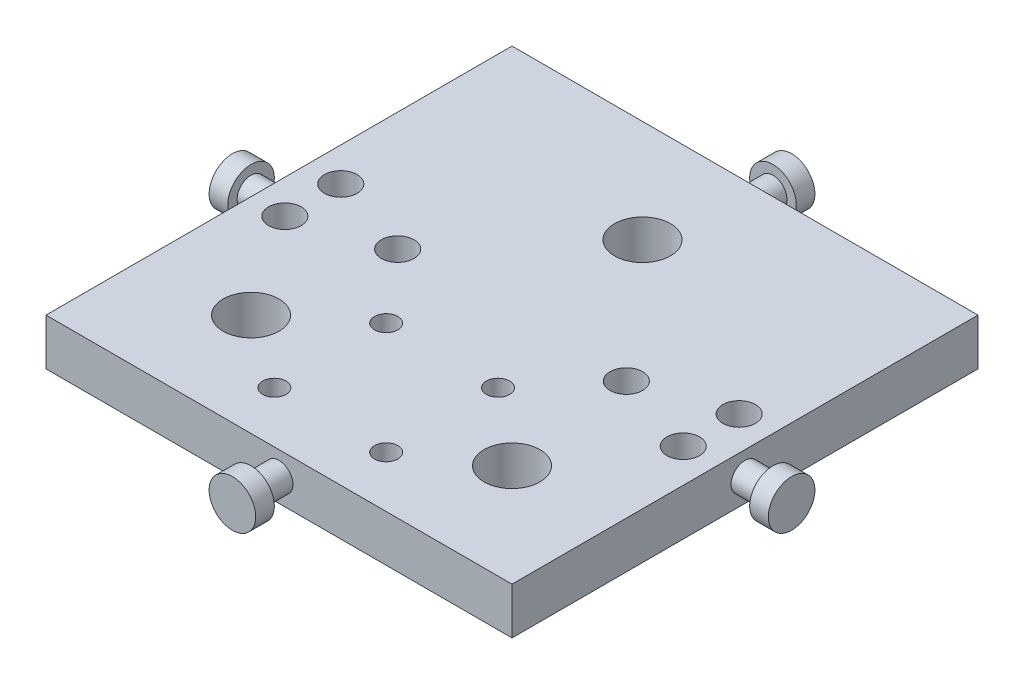
ISO-10303-21;
HEADER;
FILE_DESCRIPTION(('STEP AP214'),'2;1');
FILE_NAME('part.step','',(''),(''),'','','');
FILE_SCHEMA(('AUTOMOTIVE_DESIGN { 1 0 10303 214 1 1 1 1 }'));
ENDSEC;
DATA;
#1=APPLICATION_CONTEXT('core data for automotive mechanical design processes');
#2=APPLICATION_PROTOCOL_DEFINITION('international standard','automotive_design',2000,#1);
#3=PRODUCT_CONTEXT('',#1,'mechanical');
#4=PRODUCT('Part','Part','',(#3));
#5=PRODUCT_RELATED_PRODUCT_CATEGORY('part','',(#4));
#6=PRODUCT_DEFINITION_FORMATION('','',#4);
#7=PRODUCT_DEFINITION_CONTEXT('part definition',#1,'design');
#8=PRODUCT_DEFINITION('design','',#6,#7);
#9=PRODUCT_DEFINITION_SHAPE('','',#8);
#10=(LENGTH_UNIT() NAMED_UNIT(*) SI_UNIT(.MILLI.,.METRE.));
#11=(NAMED_UNIT(*) PLANE_ANGLE_UNIT() SI_UNIT($,.RADIAN.));
#12=(NAMED_UNIT(*) SI_UNIT($,.STERADIAN.) SOLID_ANGLE_UNIT());
#13=UNCERTAINTY_MEASURE_WITH_UNIT(LENGTH_MEASURE(1.E-05),#10,'distance_accuracy_value','');
#14=(GEOMETRIC_REPRESENTATION_CONTEXT(3) GLOBAL_UNCERTAINTY_ASSIGNED_CONTEXT((#13)) GLOBAL_UNIT_ASSIGNED_CONTEXT((#10,
#11,#12)) REPRESENTATION_CONTEXT('',''));
#15=CARTESIAN_POINT('',(0.,0.,0.));
#16=DIRECTION('',(0.,0.,1.));
#17=DIRECTION('',(1.,0.,0.));
#18=AXIS2_PLACEMENT_3D('',#15,#16,#17);
#19=CARTESIAN_POINT('',(0.,5.,0.));
#20=DIRECTION('',(1.,0.,0.));
#21=DIRECTION('',(0.,0.,-1.));
#22=AXIS2_PLACEMENT_3D('',#19,#20,#21);
#23=PLANE('',#22);
#24=DIRECTION('',(0.,0.,1.));
#25=VECTOR('',#24,1.);
#26=CARTESIAN_POINT('',(0.,0.,0.));
#27=LINE('',#26,#25);
#28=CARTESIAN_POINT('',(0.,0.,-50.));
#29=VERTEX_POINT('',#28);
#30=CARTESIAN_POINT('',(0.,0.,0.));
#31=VERTEX_POINT('',#30);
#32=EDGE_CURVE('E104',#29,#31,#27,.T.);
#33=ORIENTED_EDGE('',*,*,#32,.T.);
#34=DIRECTION('',(0.,-1.,0.));
#35=VECTOR('',#34,1.);
#36=CARTESIAN_POINT('',(0.,5.,0.));
#37=LINE('',#36,#35);
#38=CARTESIAN_POINT('',(0.,5.,0.));
#39=VERTEX_POINT('',#38);
#40=EDGE_CURVE('E11',#39,#31,#37,.T.);
#41=ORIENTED_EDGE('',*,*,#40,.F.);
#42=DIRECTION('',(0.,0.,1.));
#43=VECTOR('',#42,1.);
#44=CARTESIAN_POINT('',(0.,5.,0.));
#45=LINE('',#44,#43);
#46=CARTESIAN_POINT('',(0.,5.,-50.));
#47=VERTEX_POINT('',#46);
#48=EDGE_CURVE('E82',#47,#39,#45,.T.);
#49=ORIENTED_EDGE('',*,*,#48,.F.);
#50=DIRECTION('',(0.,-1.,0.));
#51=VECTOR('',#50,1.);
#52=CARTESIAN_POINT('',(0.,5.,-50.));
#53=LINE('',#52,#51);
#54=EDGE_CURVE('E100',#47,#29,#53,.T.);
#55=ORIENTED_EDGE('',*,*,#54,.T.);
#56=EDGE_LOOP('',(#33,#41,#49,#55));
#57=FACE_BOUND('',#56,.T.);
#58=CARTESIAN_POINT('',(0.,2.5,-25.));
#59=DIRECTION('',(1.,0.,0.));
#60=DIRECTION('',(0.,0.,-1.));
#61=AXIS2_PLACEMENT_3D('',#58,#59,#60);
#62=CIRCLE('',#61,1.5);
#63=CARTESIAN_POINT('',(0.,2.5,-26.5));
#64=VERTEX_POINT('',#63);
#65=EDGE_CURVE('E227',#64,#64,#62,.T.);
#66=ORIENTED_EDGE('',*,*,#65,.T.);
#67=EDGE_LOOP('',(#66));
#68=FACE_BOUND('',#67,.T.);
#69=ADVANCED_FACE('F38',(#57,#68),#23,.F.);
#70=CARTESIAN_POINT('',(0.,5.,0.));
#71=DIRECTION('',(0.,0.,-1.));
#72=DIRECTION('',(-1.,0.,0.));
#73=AXIS2_PLACEMENT_3D('',#70,#71,#72);
#74=PLANE('',#73);
#75=DIRECTION('',(0.,-1.,0.));
#76=VECTOR('',#75,1.);
#77=CARTESIAN_POINT('',(50.,5.,0.));
#78=LINE('',#77,#76);
#79=CARTESIAN_POINT('',(50.,5.,0.));
#80=VERTEX_POINT('',#79);
#81=CARTESIAN_POINT('',(50.,0.,0.));
#82=VERTEX_POINT('',#81);
#83=EDGE_CURVE('E46',#80,#82,#78,.T.);
#84=ORIENTED_EDGE('',*,*,#83,.F.);
#85=DIRECTION('',(1.,0.,0.));
#86=VECTOR('',#85,1.);
#87=CARTESIAN_POINT('',(0.,5.,0.));
#88=LINE('',#87,#86);
#89=EDGE_CURVE('E84',#39,#80,#88,.T.);
#90=ORIENTED_EDGE('',*,*,#89,.F.);
#91=ORIENTED_EDGE('',*,*,#40,.T.);
#92=DIRECTION('',(1.,0.,0.));
#93=VECTOR('',#92,1.);
#94=CARTESIAN_POINT('',(0.,0.,0.));
#95=LINE('',#94,#93);
#96=EDGE_CURVE('E95',#31,#82,#95,.T.);
#97=ORIENTED_EDGE('',*,*,#96,.T.);
#98=EDGE_LOOP('',(#84,#90,#91,#97));
#99=FACE_BOUND('',#98,.T.);
#100=CARTESIAN_POINT('',(25.,2.5,0.));
#101=DIRECTION('',(0.,0.,1.));
#102=DIRECTION('',(1.,0.,0.));
#103=AXIS2_PLACEMENT_3D('',#100,#101,#102);
#104=CIRCLE('',#103,1.5);
#105=CARTESIAN_POINT('',(26.5,2.5,0.));
#106=VERTEX_POINT('',#105);
#107=EDGE_CURVE('E203',#106,#106,#104,.T.);
#108=ORIENTED_EDGE('',*,*,#107,.F.);
#109=EDGE_LOOP('',(#108));
#110=FACE_BOUND('',#109,.T.);
#111=ADVANCED_FACE('F92',(#99,#110),#74,.F.);
#112=CARTESIAN_POINT('',(50.,5.,0.));
#113=DIRECTION('',(-1.,0.,0.));
#114=DIRECTION('',(0.,0.,1.));
#115=AXIS2_PLACEMENT_3D('',#112,#113,#114);
#116=PLANE('',#115);
#117=DIRECTION('',(0.,-1.,0.));
#118=VECTOR('',#117,1.);
#119=CARTESIAN_POINT('',(50.,5.,-50.));
#120=LINE('',#119,#118);
#121=CARTESIAN_POINT('',(50.,5.,-50.));
#122=VERTEX_POINT('',#121);
#123=CARTESIAN_POINT('',(50.,0.,-50.));
#124=VERTEX_POINT('',#123);
#125=EDGE_CURVE('E96',#122,#124,#120,.T.);
#126=ORIENTED_EDGE('',*,*,#125,.F.);
#127=DIRECTION('',(0.,0.,-1.));
#128=VECTOR('',#127,1.);
#129=CARTESIAN_POINT('',(50.,5.,0.));
#130=LINE('',#129,#128);
#131=EDGE_CURVE('E88',#80,#122,#130,.T.);
#132=ORIENTED_EDGE('',*,*,#131,.F.);
#133=ORIENTED_EDGE('',*,*,#83,.T.);
#134=DIRECTION('',(0.,0.,-1.));
#135=VECTOR('',#134,1.);
#136=CARTESIAN_POINT('',(50.,0.,0.));
#137=LINE('',#136,#135);
#138=EDGE_CURVE('E71',#82,#124,#137,.T.);
#139=ORIENTED_EDGE('',*,*,#138,.T.);
#140=EDGE_LOOP('',(#126,#132,#133,#139));
#141=FACE_BOUND('',#140,.T.);
#142=CARTESIAN_POINT('',(50.,2.5,-25.));
#143=DIRECTION('',(1.,0.,0.));
#144=DIRECTION('',(0.,0.,-1.));
#145=AXIS2_PLACEMENT_3D('',#142,#143,#144);
#146=CIRCLE('',#145,1.5);
#147=CARTESIAN_POINT('',(50.,2.5,-26.5));
#148=VERTEX_POINT('',#147);
#149=EDGE_CURVE('E215',#148,#148,#146,.T.);
#150=ORIENTED_EDGE('',*,*,#149,.F.);
#151=EDGE_LOOP('',(#150));
#152=FACE_BOUND('',#151,.T.);
#153=ADVANCED_FACE('F97',(#141,#152),#116,.F.);
#154=CARTESIAN_POINT('',(0.,5.,-50.));
#155=DIRECTION('',(0.,0.,1.));
#156=DIRECTION('',(1.,0.,0.));
#157=AXIS2_PLACEMENT_3D('',#154,#155,#156);
#158=PLANE('',#157);
#159=DIRECTION('',(-1.,0.,0.));
#160=VECTOR('',#159,1.);
#161=CARTESIAN_POINT('',(0.,0.,-50.));
#162=LINE('',#161,#160);
#163=EDGE_CURVE('E77',#124,#29,#162,.T.);
#164=ORIENTED_EDGE('',*,*,#163,.T.);
#165=ORIENTED_EDGE('',*,*,#54,.F.);
#166=DIRECTION('',(-1.,0.,0.));
#167=VECTOR('',#166,1.);
#168=CARTESIAN_POINT('',(0.,5.,-50.));
#169=LINE('',#168,#167);
#170=EDGE_CURVE('E54',#122,#47,#169,.T.);
#171=ORIENTED_EDGE('',*,*,#170,.F.);
#172=ORIENTED_EDGE('',*,*,#125,.T.);
#173=EDGE_LOOP('',(#164,#165,#171,#172));
#174=FACE_BOUND('',#173,.T.);
#175=CARTESIAN_POINT('',(25.,2.5,-50.));
#176=DIRECTION('',(0.,0.,1.));
#177=DIRECTION('',(1.,0.,0.));
#178=AXIS2_PLACEMENT_3D('',#175,#176,#177);
#179=CIRCLE('',#178,1.5);
#180=CARTESIAN_POINT('',(26.5,2.5,-50.));
#181=VERTEX_POINT('',#180);
#182=EDGE_CURVE('E239',#181,#181,#179,.T.);
#183=ORIENTED_EDGE('',*,*,#182,.T.);
#184=EDGE_LOOP('',(#183));
#185=FACE_BOUND('',#184,.T.);
#186=ADVANCED_FACE('F111',(#174,#185),#158,.F.);
#187=CARTESIAN_POINT('',(0.,5.,0.));
#188=DIRECTION('',(0.,-1.,0.));
#189=DIRECTION('',(0.,0.,-1.));
#190=AXIS2_PLACEMENT_3D('',#187,#188,#189);
#191=PLANE('',#190);
#192=CARTESIAN_POINT('',(46.3725166726,5.,-28.));
#193=DIRECTION('',(0.,-1.,0.));
#194=DIRECTION('',(0.,0.,-1.));
#195=AXIS2_PLACEMENT_3D('',#192,#193,#194);
#196=CIRCLE('',#195,1.75);
#197=CARTESIAN_POINT('',(46.3725166726,5.,-29.75));
#198=VERTEX_POINT('',#197);
#199=EDGE_CURVE('E164',#198,#198,#196,.T.);
#200=ORIENTED_EDGE('',*,*,#199,.T.);
#201=EDGE_LOOP('',(#200));
#202=FACE_BOUND('',#201,.T.);
#203=CARTESIAN_POINT('',(37.2645130711,5.,-25.));
#204=DIRECTION('',(0.,-1.,0.));
#205=DIRECTION('',(0.,0.,-1.));
#206=AXIS2_PLACEMENT_3D('',#203,#204,#205);
#207=CIRCLE('',#206,1.75);
#208=CARTESIAN_POINT('',(37.2645130711,5.,-26.75));
#209=VERTEX_POINT('',#208);
#210=EDGE_CURVE('E183',#209,#209,#207,.T.);
#211=ORIENTED_EDGE('',*,*,#210,.T.);
#212=EDGE_LOOP('',(#211));
#213=FACE_BOUND('',#212,.T.);
#214=CARTESIAN_POINT('',(12.7354869289,5.,-25.));
#215=DIRECTION('',(0.,-1.,0.));
#216=DIRECTION('',(0.,0.,-1.));
#217=AXIS2_PLACEMENT_3D('',#214,#215,#216);
#218=CIRCLE('',#217,1.75);
#219=CARTESIAN_POINT('',(12.7354869289,5.,-26.75));
#220=VERTEX_POINT('',#219);
#221=EDGE_CURVE('E177',#220,#220,#218,.T.);
#222=ORIENTED_EDGE('',*,*,#221,.T.);
#223=EDGE_LOOP('',(#222));
#224=FACE_BOUND('',#223,.T.);
#225=CARTESIAN_POINT('',(3.6274833274,5.,-28.));
#226=DIRECTION('',(0.,-1.,0.));
#227=DIRECTION('',(0.,0.,-1.));
#228=AXIS2_PLACEMENT_3D('',#225,#226,#227);
#229=CIRCLE('',#228,1.75);
#230=CARTESIAN_POINT('',(3.6274833274,5.,-29.75));
#231=VERTEX_POINT('',#230);
#232=EDGE_CURVE('E170',#231,#231,#229,.T.);
#233=ORIENTED_EDGE('',*,*,#232,.T.);
#234=EDGE_LOOP('',(#233));
#235=FACE_BOUND('',#234,.T.);
#236=CARTESIAN_POINT('',(3.6274833274,5.,-22.));
#237=DIRECTION('',(0.,-1.,0.));
#238=DIRECTION('',(0.,0.,-1.));
#239=AXIS2_PLACEMENT_3D('',#236,#237,#238);
#240=CIRCLE('',#239,1.75);
#241=CARTESIAN_POINT('',(3.6274833274,5.,-23.75));
#242=VERTEX_POINT('',#241);
#243=EDGE_CURVE('E171',#242,#242,#240,.T.);
#244=ORIENTED_EDGE('',*,*,#243,.T.);
#245=EDGE_LOOP('',(#244));
#246=FACE_BOUND('',#245,.T.);
#247=CARTESIAN_POINT('',(46.3725166726,5.,-22.));
#248=DIRECTION('',(0.,-1.,0.));
#249=DIRECTION('',(0.,0.,-1.));
#250=AXIS2_PLACEMENT_3D('',#247,#248,#249);
#251=CIRCLE('',#250,1.75);
#252=CARTESIAN_POINT('',(46.3725166726,5.,-23.75));
#253=VERTEX_POINT('',#252);
#254=EDGE_CURVE('E158',#253,#253,#251,.T.);
#255=ORIENTED_EDGE('',*,*,#254,.T.);
#256=EDGE_LOOP('',(#255));
#257=FACE_BOUND('',#256,.T.);
#258=CARTESIAN_POINT('',(31.,5.,-17.5));
#259=DIRECTION('',(0.,1.,0.));
#260=DIRECTION('',(0.,0.,1.));
#261=AXIS2_PLACEMENT_3D('',#258,#259,#260);
#262=CIRCLE('',#261,1.25);
#263=CARTESIAN_POINT('',(31.,5.,-16.25));
#264=VERTEX_POINT('',#263);
#265=EDGE_CURVE('E150',#264,#264,#262,.T.);
#266=ORIENTED_EDGE('',*,*,#265,.F.);
#267=EDGE_LOOP('',(#266));
#268=FACE_BOUND('',#267,.T.);
#269=CARTESIAN_POINT('',(19.,5.,-5.5));
#270=DIRECTION('',(0.,1.,0.));
#271=DIRECTION('',(0.,0.,1.));
#272=AXIS2_PLACEMENT_3D('',#269,#270,#271);
#273=CIRCLE('',#272,1.25);
#274=CARTESIAN_POINT('',(19.,5.,-4.25));
#275=VERTEX_POINT('',#274);
#276=EDGE_CURVE('E143',#275,#275,#273,.T.);
#277=ORIENTED_EDGE('',*,*,#276,.F.);
#278=EDGE_LOOP('',(#277));
#279=FACE_BOUND('',#278,.T.);
#280=CARTESIAN_POINT('',(31.,5.,-5.5));
#281=DIRECTION('',(0.,1.,0.));
#282=DIRECTION('',(0.,0.,1.));
#283=AXIS2_PLACEMENT_3D('',#280,#281,#282);
#284=CIRCLE('',#283,1.25);
#285=CARTESIAN_POINT('',(31.,5.,-4.25));
#286=VERTEX_POINT('',#285);
#287=EDGE_CURVE('E155',#286,#286,#284,.T.);
#288=ORIENTED_EDGE('',*,*,#287,.F.);
#289=EDGE_LOOP('',(#288));
#290=FACE_BOUND('',#289,.T.);
#291=CARTESIAN_POINT('',(19.,5.,-17.5));
#292=DIRECTION('',(0.,1.,0.));
#293=DIRECTION('',(0.,0.,1.));
#294=AXIS2_PLACEMENT_3D('',#291,#292,#293);
#295=CIRCLE('',#294,1.25);
#296=CARTESIAN_POINT('',(19.,5.,-16.25));
#297=VERTEX_POINT('',#296);
#298=EDGE_CURVE('E137',#297,#297,#295,.T.);
#299=ORIENTED_EDGE('',*,*,#298,.F.);
#300=EDGE_LOOP('',(#299));
#301=FACE_BOUND('',#300,.T.);
#302=CARTESIAN_POINT('',(25.,5.,-39.));
#303=DIRECTION('',(0.,1.,0.));
#304=DIRECTION('',(0.,0.,1.));
#305=AXIS2_PLACEMENT_3D('',#302,#303,#304);
#306=CIRCLE('',#305,3.);
#307=CARTESIAN_POINT('',(25.,5.,-36.));
#308=VERTEX_POINT('',#307);
#309=EDGE_CURVE('E132',#308,#308,#306,.T.);
#310=ORIENTED_EDGE('',*,*,#309,.F.);
#311=EDGE_LOOP('',(#310));
#312=FACE_BOUND('',#311,.T.);
#313=CARTESIAN_POINT('',(11.,5.,-11.));
#314=DIRECTION('',(0.,1.,0.));
#315=DIRECTION('',(0.,0.,1.));
#316=AXIS2_PLACEMENT_3D('',#313,#314,#315);
#317=CIRCLE('',#316,3.);
#318=CARTESIAN_POINT('',(11.,5.,-8.));
#319=VERTEX_POINT('',#318);
#320=EDGE_CURVE('E126',#319,#319,#317,.T.);
#321=ORIENTED_EDGE('',*,*,#320,.F.);
#322=EDGE_LOOP('',(#321));
#323=FACE_BOUND('',#322,.T.);
#324=CARTESIAN_POINT('',(39.,5.,-11.));
#325=DIRECTION('',(0.,1.,0.));
#326=DIRECTION('',(0.,0.,1.));
#327=AXIS2_PLACEMENT_3D('',#324,#325,#326);
#328=CIRCLE('',#327,3.);
#329=CARTESIAN_POINT('',(39.,5.,-8.));
#330=VERTEX_POINT('',#329);
#331=EDGE_CURVE('E119',#330,#330,#328,.T.);
#332=ORIENTED_EDGE('',*,*,#331,.F.);
#333=EDGE_LOOP('',(#332));
#334=FACE_BOUND('',#333,.T.);
#335=ORIENTED_EDGE('',*,*,#48,.T.);
#336=ORIENTED_EDGE('',*,*,#89,.T.);
#337=ORIENTED_EDGE('',*,*,#131,.T.);
#338=ORIENTED_EDGE('',*,*,#170,.T.);
#339=EDGE_LOOP('',(#335,#336,#337,#338));
#340=FACE_BOUND('',#339,.T.);
#341=ADVANCED_FACE('F86',(#202,#213,#224,#235,#246,#257,#268,#279,#290,#301,#312,#323,#334,
#340),#191,.F.);
#342=CARTESIAN_POINT('',(0.,0.,0.));
#343=DIRECTION('',(0.,-1.,0.));
#344=DIRECTION('',(0.,0.,-1.));
#345=AXIS2_PLACEMENT_3D('',#342,#343,#344);
#346=PLANE('',#345);
#347=CARTESIAN_POINT('',(46.3725166726,0.,-28.));
#348=DIRECTION('',(0.,-1.,0.));
#349=DIRECTION('',(0.,0.,-1.));
#350=AXIS2_PLACEMENT_3D('',#347,#348,#349);
#351=CIRCLE('',#350,1.75);
#352=CARTESIAN_POINT('',(46.3725166726,0.,-29.75));
#353=VERTEX_POINT('',#352);
#354=EDGE_CURVE('E186',#353,#353,#351,.T.);
#355=ORIENTED_EDGE('',*,*,#354,.F.);
#356=EDGE_LOOP('',(#355));
#357=FACE_BOUND('',#356,.T.);
#358=CARTESIAN_POINT('',(37.2645130711,0.,-25.));
#359=DIRECTION('',(0.,-1.,0.));
#360=DIRECTION('',(0.,0.,-1.));
#361=AXIS2_PLACEMENT_3D('',#358,#359,#360);
#362=CIRCLE('',#361,1.75);
#363=CARTESIAN_POINT('',(37.2645130711,0.,-26.75));
#364=VERTEX_POINT('',#363);
#365=EDGE_CURVE('E180',#364,#364,#362,.T.);
#366=ORIENTED_EDGE('',*,*,#365,.F.);
#367=EDGE_LOOP('',(#366));
#368=FACE_BOUND('',#367,.T.);
#369=CARTESIAN_POINT('',(12.7354869289,0.,-25.));
#370=DIRECTION('',(0.,-1.,0.));
#371=DIRECTION('',(0.,0.,-1.));
#372=AXIS2_PLACEMENT_3D('',#369,#370,#371);
#373=CIRCLE('',#372,1.75);
#374=CARTESIAN_POINT('',(12.7354869289,0.,-26.75));
#375=VERTEX_POINT('',#374);
#376=EDGE_CURVE('E174',#375,#375,#373,.T.);
#377=ORIENTED_EDGE('',*,*,#376,.F.);
#378=EDGE_LOOP('',(#377));
#379=FACE_BOUND('',#378,.T.);
#380=CARTESIAN_POINT('',(3.6274833274,0.,-28.));
#381=DIRECTION('',(0.,-1.,0.));
#382=DIRECTION('',(0.,0.,-1.));
#383=AXIS2_PLACEMENT_3D('',#380,#381,#382);
#384=CIRCLE('',#383,1.75);
#385=CARTESIAN_POINT('',(3.6274833274,0.,-29.75));
#386=VERTEX_POINT('',#385);
#387=EDGE_CURVE('E167',#386,#386,#384,.T.);
#388=ORIENTED_EDGE('',*,*,#387,.F.);
#389=EDGE_LOOP('',(#388));
#390=FACE_BOUND('',#389,.T.);
#391=CARTESIAN_POINT('',(3.6274833274,0.,-22.));
#392=DIRECTION('',(0.,-1.,0.));
#393=DIRECTION('',(0.,0.,-1.));
#394=AXIS2_PLACEMENT_3D('',#391,#392,#393);
#395=CIRCLE('',#394,1.75);
#396=CARTESIAN_POINT('',(3.6274833274,0.,-23.75));
#397=VERTEX_POINT('',#396);
#398=EDGE_CURVE('E191',#397,#397,#395,.T.);
#399=ORIENTED_EDGE('',*,*,#398,.F.);
#400=EDGE_LOOP('',(#399));
#401=FACE_BOUND('',#400,.T.);
#402=CARTESIAN_POINT('',(46.3725166726,0.,-22.));
#403=DIRECTION('',(0.,-1.,0.));
#404=DIRECTION('',(0.,0.,-1.));
#405=AXIS2_PLACEMENT_3D('',#402,#403,#404);
#406=CIRCLE('',#405,1.75);
#407=CARTESIAN_POINT('',(46.3725166726,0.,-23.75));
#408=VERTEX_POINT('',#407);
#409=EDGE_CURVE('E161',#408,#408,#406,.T.);
#410=ORIENTED_EDGE('',*,*,#409,.F.);
#411=EDGE_LOOP('',(#410));
#412=FACE_BOUND('',#411,.T.);
#413=CARTESIAN_POINT('',(31.,0.,-17.5));
#414=DIRECTION('',(0.,1.,0.));
#415=DIRECTION('',(0.,0.,1.));
#416=AXIS2_PLACEMENT_3D('',#413,#414,#415);
#417=CIRCLE('',#416,1.25);
#418=CARTESIAN_POINT('',(31.,0.,-16.25));
#419=VERTEX_POINT('',#418);
#420=EDGE_CURVE('E140',#419,#419,#417,.T.);
#421=ORIENTED_EDGE('',*,*,#420,.T.);
#422=EDGE_LOOP('',(#421));
#423=FACE_BOUND('',#422,.T.);
#424=CARTESIAN_POINT('',(19.,0.,-5.5));
#425=DIRECTION('',(0.,1.,0.));
#426=DIRECTION('',(0.,0.,1.));
#427=AXIS2_PLACEMENT_3D('',#424,#425,#426);
#428=CIRCLE('',#427,1.25);
#429=CARTESIAN_POINT('',(19.,0.,-4.25));
#430=VERTEX_POINT('',#429);
#431=EDGE_CURVE('E146',#430,#430,#428,.T.);
#432=ORIENTED_EDGE('',*,*,#431,.T.);
#433=EDGE_LOOP('',(#432));
#434=FACE_BOUND('',#433,.T.);
#435=CARTESIAN_POINT('',(31.,0.,-5.5));
#436=DIRECTION('',(0.,1.,0.));
#437=DIRECTION('',(0.,0.,1.));
#438=AXIS2_PLACEMENT_3D('',#435,#436,#437);
#439=CIRCLE('',#438,1.25);
#440=CARTESIAN_POINT('',(31.,0.,-4.25));
#441=VERTEX_POINT('',#440);
#442=EDGE_CURVE('E147',#441,#441,#439,.T.);
#443=ORIENTED_EDGE('',*,*,#442,.T.);
#444=EDGE_LOOP('',(#443));
#445=FACE_BOUND('',#444,.T.);
#446=CARTESIAN_POINT('',(19.,0.,-17.5));
#447=DIRECTION('',(0.,1.,0.));
#448=DIRECTION('',(0.,0.,1.));
#449=AXIS2_PLACEMENT_3D('',#446,#447,#448);
#450=CIRCLE('',#449,1.25);
#451=CARTESIAN_POINT('',(19.,0.,-16.25));
#452=VERTEX_POINT('',#451);
#453=EDGE_CURVE('E123',#452,#452,#450,.T.);
#454=ORIENTED_EDGE('',*,*,#453,.T.);
#455=EDGE_LOOP('',(#454));
#456=FACE_BOUND('',#455,.T.);
#457=CARTESIAN_POINT('',(25.,0.,-39.));
#458=DIRECTION('',(0.,1.,0.));
#459=DIRECTION('',(0.,0.,1.));
#460=AXIS2_PLACEMENT_3D('',#457,#458,#459);
#461=CIRCLE('',#460,3.);
#462=CARTESIAN_POINT('',(25.,0.,-36.));
#463=VERTEX_POINT('',#462);
#464=EDGE_CURVE('E106',#463,#463,#461,.T.);
#465=ORIENTED_EDGE('',*,*,#464,.T.);
#466=EDGE_LOOP('',(#465));
#467=FACE_BOUND('',#466,.T.);
#468=CARTESIAN_POINT('',(11.,0.,-11.));
#469=DIRECTION('',(0.,1.,0.));
#470=DIRECTION('',(0.,0.,1.));
#471=AXIS2_PLACEMENT_3D('',#468,#469,#470);
#472=CIRCLE('',#471,3.);
#473=CARTESIAN_POINT('',(11.,0.,-8.));
#474=VERTEX_POINT('',#473);
#475=EDGE_CURVE('E129',#474,#474,#472,.T.);
#476=ORIENTED_EDGE('',*,*,#475,.T.);
#477=EDGE_LOOP('',(#476));
#478=FACE_BOUND('',#477,.T.);
#479=CARTESIAN_POINT('',(39.,0.,-11.));
#480=DIRECTION('',(0.,1.,0.));
#481=DIRECTION('',(0.,0.,1.));
#482=AXIS2_PLACEMENT_3D('',#479,#480,#481);
#483=CIRCLE('',#482,3.);
#484=CARTESIAN_POINT('',(39.,0.,-8.));
#485=VERTEX_POINT('',#484);
#486=EDGE_CURVE('E122',#485,#485,#483,.T.);
#487=ORIENTED_EDGE('',*,*,#486,.T.);
#488=EDGE_LOOP('',(#487));
#489=FACE_BOUND('',#488,.T.);
#490=ORIENTED_EDGE('',*,*,#32,.F.);
#491=ORIENTED_EDGE('',*,*,#163,.F.);
#492=ORIENTED_EDGE('',*,*,#138,.F.);
#493=ORIENTED_EDGE('',*,*,#96,.F.);
#494=EDGE_LOOP('',(#490,#491,#492,#493));
#495=FACE_BOUND('',#494,.T.);
#496=ADVANCED_FACE('F115',(#357,#368,#379,#390,#401,#412,#423,#434,#445,#456,#467,#478,#489,
#495),#346,.T.);
#497=CARTESIAN_POINT('',(39.,0.,-11.));
#498=DIRECTION('',(0.,1.,0.));
#499=DIRECTION('',(0.,0.,1.));
#500=AXIS2_PLACEMENT_3D('',#497,#498,#499);
#501=CYLINDRICAL_SURFACE('',#500,3.);
#502=ORIENTED_EDGE('',*,*,#486,.F.);
#503=EDGE_LOOP('',(#502));
#504=FACE_BOUND('',#503,.T.);
#505=ORIENTED_EDGE('',*,*,#331,.T.);
#506=EDGE_LOOP('',(#505));
#507=FACE_BOUND('',#506,.T.);
#508=ADVANCED_FACE('F281',(#504,#507),#501,.F.);
#509=CARTESIAN_POINT('',(11.,0.,-11.));
#510=DIRECTION('',(0.,1.,0.));
#511=DIRECTION('',(0.,0.,1.));
#512=AXIS2_PLACEMENT_3D('',#509,#510,#511);
#513=CYLINDRICAL_SURFACE('',#512,3.);
#514=ORIENTED_EDGE('',*,*,#475,.F.);
#515=EDGE_LOOP('',(#514));
#516=FACE_BOUND('',#515,.T.);
#517=ORIENTED_EDGE('',*,*,#320,.T.);
#518=EDGE_LOOP('',(#517));
#519=FACE_BOUND('',#518,.T.);
#520=ADVANCED_FACE('F288',(#516,#519),#513,.F.);
#521=CARTESIAN_POINT('',(25.,0.,-39.));
#522=DIRECTION('',(0.,1.,0.));
#523=DIRECTION('',(0.,0.,1.));
#524=AXIS2_PLACEMENT_3D('',#521,#522,#523);
#525=CYLINDRICAL_SURFACE('',#524,3.);
#526=ORIENTED_EDGE('',*,*,#464,.F.);
#527=EDGE_LOOP('',(#526));
#528=FACE_BOUND('',#527,.T.);
#529=ORIENTED_EDGE('',*,*,#309,.T.);
#530=EDGE_LOOP('',(#529));
#531=FACE_BOUND('',#530,.T.);
#532=ADVANCED_FACE('F292',(#528,#531),#525,.F.);
#533=CARTESIAN_POINT('',(19.,0.,-17.5));
#534=DIRECTION('',(0.,1.,0.));
#535=DIRECTION('',(0.,0.,1.));
#536=AXIS2_PLACEMENT_3D('',#533,#534,#535);
#537=CYLINDRICAL_SURFACE('',#536,1.25);
#538=ORIENTED_EDGE('',*,*,#453,.F.);
#539=EDGE_LOOP('',(#538));
#540=FACE_BOUND('',#539,.T.);
#541=ORIENTED_EDGE('',*,*,#298,.T.);
#542=EDGE_LOOP('',(#541));
#543=FACE_BOUND('',#542,.T.);
#544=ADVANCED_FACE('F296',(#540,#543),#537,.F.);
#545=CARTESIAN_POINT('',(31.,0.,-5.5));
#546=DIRECTION('',(0.,1.,0.));
#547=DIRECTION('',(0.,0.,1.));
#548=AXIS2_PLACEMENT_3D('',#545,#546,#547);
#549=CYLINDRICAL_SURFACE('',#548,1.25);
#550=ORIENTED_EDGE('',*,*,#442,.F.);
#551=EDGE_LOOP('',(#550));
#552=FACE_BOUND('',#551,.T.);
#553=ORIENTED_EDGE('',*,*,#287,.T.);
#554=EDGE_LOOP('',(#553));
#555=FACE_BOUND('',#554,.T.);
#556=ADVANCED_FACE('F300',(#552,#555),#549,.F.);
#557=CARTESIAN_POINT('',(19.,0.,-5.5));
#558=DIRECTION('',(0.,1.,0.));
#559=DIRECTION('',(0.,0.,1.));
#560=AXIS2_PLACEMENT_3D('',#557,#558,#559);
#561=CYLINDRICAL_SURFACE('',#560,1.25);
#562=ORIENTED_EDGE('',*,*,#431,.F.);
#563=EDGE_LOOP('',(#562));
#564=FACE_BOUND('',#563,.T.);
#565=ORIENTED_EDGE('',*,*,#276,.T.);
#566=EDGE_LOOP('',(#565));
#567=FACE_BOUND('',#566,.T.);
#568=ADVANCED_FACE('F302',(#564,#567),#561,.F.);
#569=CARTESIAN_POINT('',(31.,0.,-17.5));
#570=DIRECTION('',(0.,1.,0.));
#571=DIRECTION('',(0.,0.,1.));
#572=AXIS2_PLACEMENT_3D('',#569,#570,#571);
#573=CYLINDRICAL_SURFACE('',#572,1.25);
#574=ORIENTED_EDGE('',*,*,#420,.F.);
#575=EDGE_LOOP('',(#574));
#576=FACE_BOUND('',#575,.T.);
#577=ORIENTED_EDGE('',*,*,#265,.T.);
#578=EDGE_LOOP('',(#577));
#579=FACE_BOUND('',#578,.T.);
#580=ADVANCED_FACE('F305',(#576,#579),#573,.F.);
#581=CARTESIAN_POINT('',(46.3725166726,5.,-22.));
#582=DIRECTION('',(0.,-1.,0.));
#583=DIRECTION('',(0.,0.,-1.));
#584=AXIS2_PLACEMENT_3D('',#581,#582,#583);
#585=CYLINDRICAL_SURFACE('',#584,1.75);
#586=ORIENTED_EDGE('',*,*,#254,.F.);
#587=EDGE_LOOP('',(#586));
#588=FACE_BOUND('',#587,.T.);
#589=ORIENTED_EDGE('',*,*,#409,.T.);
#590=EDGE_LOOP('',(#589));
#591=FACE_BOUND('',#590,.T.);
#592=ADVANCED_FACE('F309',(#588,#591),#585,.F.);
#593=CARTESIAN_POINT('',(3.6274833274,5.,-22.));
#594=DIRECTION('',(0.,-1.,0.));
#595=DIRECTION('',(0.,0.,-1.));
#596=AXIS2_PLACEMENT_3D('',#593,#594,#595);
#597=CYLINDRICAL_SURFACE('',#596,1.75);
#598=ORIENTED_EDGE('',*,*,#243,.F.);
#599=EDGE_LOOP('',(#598));
#600=FACE_BOUND('',#599,.T.);
#601=ORIENTED_EDGE('',*,*,#398,.T.);
#602=EDGE_LOOP('',(#601));
#603=FACE_BOUND('',#602,.T.);
#604=ADVANCED_FACE('F316',(#600,#603),#597,.F.);
#605=CARTESIAN_POINT('',(3.6274833274,5.,-28.));
#606=DIRECTION('',(0.,-1.,0.));
#607=DIRECTION('',(0.,0.,-1.));
#608=AXIS2_PLACEMENT_3D('',#605,#606,#607);
#609=CYLINDRICAL_SURFACE('',#608,1.75);
#610=ORIENTED_EDGE('',*,*,#232,.F.);
#611=EDGE_LOOP('',(#610));
#612=FACE_BOUND('',#611,.T.);
#613=ORIENTED_EDGE('',*,*,#387,.T.);
#614=EDGE_LOOP('',(#613));
#615=FACE_BOUND('',#614,.T.);
#616=ADVANCED_FACE('F318',(#612,#615),#609,.F.);
#617=CARTESIAN_POINT('',(12.7354869289,5.,-25.));
#618=DIRECTION('',(0.,-1.,0.));
#619=DIRECTION('',(0.,0.,-1.));
#620=AXIS2_PLACEMENT_3D('',#617,#618,#619);
#621=CYLINDRICAL_SURFACE('',#620,1.75);
#622=ORIENTED_EDGE('',*,*,#221,.F.);
#623=EDGE_LOOP('',(#622));
#624=FACE_BOUND('',#623,.T.);
#625=ORIENTED_EDGE('',*,*,#376,.T.);
#626=EDGE_LOOP('',(#625));
#627=FACE_BOUND('',#626,.T.);
#628=ADVANCED_FACE('F321',(#624,#627),#621,.F.);
#629=CARTESIAN_POINT('',(37.2645130711,5.,-25.));
#630=DIRECTION('',(0.,-1.,0.));
#631=DIRECTION('',(0.,0.,-1.));
#632=AXIS2_PLACEMENT_3D('',#629,#630,#631);
#633=CYLINDRICAL_SURFACE('',#632,1.75);
#634=ORIENTED_EDGE('',*,*,#210,.F.);
#635=EDGE_LOOP('',(#634));
#636=FACE_BOUND('',#635,.T.);
#637=ORIENTED_EDGE('',*,*,#365,.T.);
#638=EDGE_LOOP('',(#637));
#639=FACE_BOUND('',#638,.T.);
#640=ADVANCED_FACE('F325',(#636,#639),#633,.F.);
#641=CARTESIAN_POINT('',(46.3725166726,5.,-28.));
#642=DIRECTION('',(0.,-1.,0.));
#643=DIRECTION('',(0.,0.,-1.));
#644=AXIS2_PLACEMENT_3D('',#641,#642,#643);
#645=CYLINDRICAL_SURFACE('',#644,1.75);
#646=ORIENTED_EDGE('',*,*,#199,.F.);
#647=EDGE_LOOP('',(#646));
#648=FACE_BOUND('',#647,.T.);
#649=ORIENTED_EDGE('',*,*,#354,.T.);
#650=EDGE_LOOP('',(#649));
#651=FACE_BOUND('',#650,.T.);
#652=ADVANCED_FACE('F329',(#648,#651),#645,.F.);
#653=CARTESIAN_POINT('',(25.,2.5,3.));
#654=DIRECTION('',(0.,0.,1.));
#655=DIRECTION('',(1.,0.,0.));
#656=AXIS2_PLACEMENT_3D('',#653,#654,#655);
#657=PLANE('',#656);
#658=CARTESIAN_POINT('',(25.,2.5,3.));
#659=DIRECTION('',(0.,0.,1.));
#660=DIRECTION('',(1.,0.,0.));
#661=AXIS2_PLACEMENT_3D('',#658,#659,#660);
#662=CIRCLE('',#661,2.5);
#663=CARTESIAN_POINT('',(27.5,2.5,3.));
#664=VERTEX_POINT('',#663);
#665=EDGE_CURVE('E199',#664,#664,#662,.T.);
#666=ORIENTED_EDGE('',*,*,#665,.F.);
#667=EDGE_LOOP('',(#666));
#668=FACE_BOUND('',#667,.T.);
#669=CARTESIAN_POINT('',(25.,2.5,3.));
#670=DIRECTION('',(0.,0.,1.));
#671=DIRECTION('',(1.,0.,0.));
#672=AXIS2_PLACEMENT_3D('',#669,#670,#671);
#673=CIRCLE('',#672,1.5);
#674=CARTESIAN_POINT('',(26.5,2.5,3.));
#675=VERTEX_POINT('',#674);
#676=EDGE_CURVE('E202',#675,#675,#673,.T.);
#677=ORIENTED_EDGE('',*,*,#676,.T.);
#678=EDGE_LOOP('',(#677));
#679=FACE_BOUND('',#678,.T.);
#680=ADVANCED_FACE('F333',(#668,#679),#657,.F.);
#681=CARTESIAN_POINT('',(25.,2.5,3.));
#682=DIRECTION('',(0.,0.,-1.));
#683=DIRECTION('',(-1.,0.,0.));
#684=AXIS2_PLACEMENT_3D('',#681,#682,#683);
#685=CYLINDRICAL_SURFACE('',#684,1.5);
#686=ORIENTED_EDGE('',*,*,#676,.F.);
#687=EDGE_LOOP('',(#686));
#688=FACE_BOUND('',#687,.T.);
#689=ORIENTED_EDGE('',*,*,#107,.T.);
#690=EDGE_LOOP('',(#689));
#691=FACE_BOUND('',#690,.T.);
#692=ADVANCED_FACE('F346',(#688,#691),#685,.T.);
#693=CARTESIAN_POINT('',(25.,2.5,5.));
#694=DIRECTION('',(0.,0.,1.));
#695=DIRECTION('',(1.,0.,0.));
#696=AXIS2_PLACEMENT_3D('',#693,#694,#695);
#697=PLANE('',#696);
#698=CARTESIAN_POINT('',(25.,2.5,5.));
#699=DIRECTION('',(0.,0.,1.));
#700=DIRECTION('',(1.,0.,0.));
#701=AXIS2_PLACEMENT_3D('',#698,#699,#700);
#702=CIRCLE('',#701,2.5);
#703=CARTESIAN_POINT('',(27.5,2.5,5.));
#704=VERTEX_POINT('',#703);
#705=EDGE_CURVE('E194',#704,#704,#702,.T.);
#706=ORIENTED_EDGE('',*,*,#705,.T.);
#707=EDGE_LOOP('',(#706));
#708=FACE_BOUND('',#707,.T.);
#709=ADVANCED_FACE('F342',(#708),#697,.T.);
#710=CARTESIAN_POINT('',(25.,2.5,5.));
#711=DIRECTION('',(0.,0.,-1.));
#712=DIRECTION('',(-1.,0.,0.));
#713=AXIS2_PLACEMENT_3D('',#710,#711,#712);
#714=CYLINDRICAL_SURFACE('',#713,2.5);
#715=ORIENTED_EDGE('',*,*,#665,.T.);
#716=EDGE_LOOP('',(#715));
#717=FACE_BOUND('',#716,.T.);
#718=ORIENTED_EDGE('',*,*,#705,.F.);
#719=EDGE_LOOP('',(#718));
#720=FACE_BOUND('',#719,.T.);
#721=ADVANCED_FACE('F338',(#717,#720),#714,.T.);
#722=CARTESIAN_POINT('',(53.,2.5,-25.));
#723=DIRECTION('',(1.,0.,0.));
#724=DIRECTION('',(0.,0.,-1.));
#725=AXIS2_PLACEMENT_3D('',#722,#723,#724);
#726=PLANE('',#725);
#727=CARTESIAN_POINT('',(53.,2.5,-25.));
#728=DIRECTION('',(1.,0.,0.));
#729=DIRECTION('',(0.,0.,-1.));
#730=AXIS2_PLACEMENT_3D('',#727,#728,#729);
#731=CIRCLE('',#730,2.5);
#732=CARTESIAN_POINT('',(53.,2.5,-27.5));
#733=VERTEX_POINT('',#732);
#734=EDGE_CURVE('E211',#733,#733,#731,.T.);
#735=ORIENTED_EDGE('',*,*,#734,.F.);
#736=EDGE_LOOP('',(#735));
#737=FACE_BOUND('',#736,.T.);
#738=CARTESIAN_POINT('',(53.,2.5,-25.));
#739=DIRECTION('',(1.,0.,0.));
#740=DIRECTION('',(0.,0.,-1.));
#741=AXIS2_PLACEMENT_3D('',#738,#739,#740);
#742=CIRCLE('',#741,1.5);
#743=CARTESIAN_POINT('',(53.,2.5,-26.5));
#744=VERTEX_POINT('',#743);
#745=EDGE_CURVE('E214',#744,#744,#742,.T.);
#746=ORIENTED_EDGE('',*,*,#745,.T.);
#747=EDGE_LOOP('',(#746));
#748=FACE_BOUND('',#747,.T.);
#749=ADVANCED_FACE('F341',(#737,#748),#726,.F.);
#750=CARTESIAN_POINT('',(53.,2.5,-25.));
#751=DIRECTION('',(-1.,0.,0.));
#752=DIRECTION('',(0.,0.,1.));
#753=AXIS2_PLACEMENT_3D('',#750,#751,#752);
#754=CYLINDRICAL_SURFACE('',#753,1.5);
#755=ORIENTED_EDGE('',*,*,#745,.F.);
#756=EDGE_LOOP('',(#755));
#757=FACE_BOUND('',#756,.T.);
#758=ORIENTED_EDGE('',*,*,#149,.T.);
#759=EDGE_LOOP('',(#758));
#760=FACE_BOUND('',#759,.T.);
#761=ADVANCED_FACE('F362',(#757,#760),#754,.T.);
#762=CARTESIAN_POINT('',(55.,2.5,-25.));
#763=DIRECTION('',(1.,0.,0.));
#764=DIRECTION('',(0.,0.,-1.));
#765=AXIS2_PLACEMENT_3D('',#762,#763,#764);
#766=PLANE('',#765);
#767=CARTESIAN_POINT('',(55.,2.5,-25.));
#768=DIRECTION('',(1.,0.,0.));
#769=DIRECTION('',(0.,0.,-1.));
#770=AXIS2_PLACEMENT_3D('',#767,#768,#769);
#771=CIRCLE('',#770,2.5);
#772=CARTESIAN_POINT('',(55.,2.5,-27.5));
#773=VERTEX_POINT('',#772);
#774=EDGE_CURVE('E206',#773,#773,#771,.T.);
#775=ORIENTED_EDGE('',*,*,#774,.T.);
#776=EDGE_LOOP('',(#775));
#777=FACE_BOUND('',#776,.T.);
#778=ADVANCED_FACE('F358',(#777),#766,.T.);
#779=CARTESIAN_POINT('',(55.,2.5,-25.));
#780=DIRECTION('',(-1.,0.,0.));
#781=DIRECTION('',(0.,0.,1.));
#782=AXIS2_PLACEMENT_3D('',#779,#780,#781);
#783=CYLINDRICAL_SURFACE('',#782,2.5);
#784=ORIENTED_EDGE('',*,*,#734,.T.);
#785=EDGE_LOOP('',(#784));
#786=FACE_BOUND('',#785,.T.);
#787=ORIENTED_EDGE('',*,*,#774,.F.);
#788=EDGE_LOOP('',(#787));
#789=FACE_BOUND('',#788,.T.);
#790=ADVANCED_FACE('F354',(#786,#789),#783,.T.);
#791=CARTESIAN_POINT('',(-3.,2.5,-25.));
#792=DIRECTION('',(-1.,0.,0.));
#793=DIRECTION('',(0.,0.,-1.));
#794=AXIS2_PLACEMENT_3D('',#791,#792,#793);
#795=PLANE('',#794);
#796=CARTESIAN_POINT('',(-3.,2.5,-25.));
#797=DIRECTION('',(1.,0.,0.));
#798=DIRECTION('',(0.,0.,-1.));
#799=AXIS2_PLACEMENT_3D('',#796,#797,#798);
#800=CIRCLE('',#799,1.5);
#801=CARTESIAN_POINT('',(-3.,2.5,-26.5));
#802=VERTEX_POINT('',#801);
#803=EDGE_CURVE('E226',#802,#802,#800,.T.);
#804=ORIENTED_EDGE('',*,*,#803,.F.);
#805=EDGE_LOOP('',(#804));
#806=FACE_BOUND('',#805,.T.);
#807=CARTESIAN_POINT('',(-3.,2.5,-25.));
#808=DIRECTION('',(1.,0.,0.));
#809=DIRECTION('',(0.,0.,-1.));
#810=AXIS2_PLACEMENT_3D('',#807,#808,#809);
#811=CIRCLE('',#810,2.5);
#812=CARTESIAN_POINT('',(-3.,2.5,-27.5));
#813=VERTEX_POINT('',#812);
#814=EDGE_CURVE('E223',#813,#813,#811,.T.);
#815=ORIENTED_EDGE('',*,*,#814,.T.);
#816=EDGE_LOOP('',(#815));
#817=FACE_BOUND('',#816,.T.);
#818=ADVANCED_FACE('F357',(#806,#817),#795,.F.);
#819=CARTESIAN_POINT('',(-3.,2.5,-25.));
#820=DIRECTION('',(1.,0.,0.));
#821=DIRECTION('',(0.,0.,-1.));
#822=AXIS2_PLACEMENT_3D('',#819,#820,#821);
#823=CYLINDRICAL_SURFACE('',#822,1.5);
#824=ORIENTED_EDGE('',*,*,#803,.T.);
#825=EDGE_LOOP('',(#824));
#826=FACE_BOUND('',#825,.T.);
#827=ORIENTED_EDGE('',*,*,#65,.F.);
#828=EDGE_LOOP('',(#827));
#829=FACE_BOUND('',#828,.T.);
#830=ADVANCED_FACE('F376',(#826,#829),#823,.T.);
#831=CARTESIAN_POINT('',(-5.,2.5,-25.));
#832=DIRECTION('',(-1.,0.,0.));
#833=DIRECTION('',(0.,0.,-1.));
#834=AXIS2_PLACEMENT_3D('',#831,#832,#833);
#835=PLANE('',#834);
#836=CARTESIAN_POINT('',(-5.,2.5,-25.));
#837=DIRECTION('',(1.,0.,0.));
#838=DIRECTION('',(0.,0.,-1.));
#839=AXIS2_PLACEMENT_3D('',#836,#837,#838);
#840=CIRCLE('',#839,2.5);
#841=CARTESIAN_POINT('',(-5.,2.5,-27.5));
#842=VERTEX_POINT('',#841);
#843=EDGE_CURVE('E218',#842,#842,#840,.T.);
#844=ORIENTED_EDGE('',*,*,#843,.F.);
#845=EDGE_LOOP('',(#844));
#846=FACE_BOUND('',#845,.T.);
#847=ADVANCED_FACE('F372',(#846),#835,.T.);
#848=CARTESIAN_POINT('',(-5.,2.5,-25.));
#849=DIRECTION('',(1.,0.,0.));
#850=DIRECTION('',(0.,0.,-1.));
#851=AXIS2_PLACEMENT_3D('',#848,#849,#850);
#852=CYLINDRICAL_SURFACE('',#851,2.5);
#853=ORIENTED_EDGE('',*,*,#814,.F.);
#854=EDGE_LOOP('',(#853));
#855=FACE_BOUND('',#854,.T.);
#856=ORIENTED_EDGE('',*,*,#843,.T.);
#857=EDGE_LOOP('',(#856));
#858=FACE_BOUND('',#857,.T.);
#859=ADVANCED_FACE('F251',(#855,#858),#852,.T.);
#860=CARTESIAN_POINT('',(25.,2.5,-53.));
#861=DIRECTION('',(0.,0.,-1.));
#862=DIRECTION('',(1.,0.,0.));
#863=AXIS2_PLACEMENT_3D('',#860,#861,#862);
#864=PLANE('',#863);
#865=CARTESIAN_POINT('',(25.,2.5,-53.));
#866=DIRECTION('',(0.,0.,1.));
#867=DIRECTION('',(1.,0.,0.));
#868=AXIS2_PLACEMENT_3D('',#865,#866,#867);
#869=CIRCLE('',#868,1.5);
#870=CARTESIAN_POINT('',(26.5,2.5,-53.));
#871=VERTEX_POINT('',#870);
#872=EDGE_CURVE('E238',#871,#871,#869,.T.);
#873=ORIENTED_EDGE('',*,*,#872,.F.);
#874=EDGE_LOOP('',(#873));
#875=FACE_BOUND('',#874,.T.);
#876=CARTESIAN_POINT('',(25.,2.5,-53.));
#877=DIRECTION('',(0.,0.,1.));
#878=DIRECTION('',(1.,0.,0.));
#879=AXIS2_PLACEMENT_3D('',#876,#877,#878);
#880=CIRCLE('',#879,2.5);
#881=CARTESIAN_POINT('',(27.5,2.5,-53.));
#882=VERTEX_POINT('',#881);
#883=EDGE_CURVE('E235',#882,#882,#880,.T.);
#884=ORIENTED_EDGE('',*,*,#883,.T.);
#885=EDGE_LOOP('',(#884));
#886=FACE_BOUND('',#885,.T.);
#887=ADVANCED_FACE('F248',(#875,#886),#864,.F.);
#888=CARTESIAN_POINT('',(25.,2.5,-53.));
#889=DIRECTION('',(0.,0.,1.));
#890=DIRECTION('',(1.,0.,0.));
#891=AXIS2_PLACEMENT_3D('',#888,#889,#890);
#892=CYLINDRICAL_SURFACE('',#891,1.5);
#893=ORIENTED_EDGE('',*,*,#872,.T.);
#894=EDGE_LOOP('',(#893));
#895=FACE_BOUND('',#894,.T.);
#896=ORIENTED_EDGE('',*,*,#182,.F.);
#897=EDGE_LOOP('',(#896));
#898=FACE_BOUND('',#897,.T.);
#899=ADVANCED_FACE('F245',(#895,#898),#892,.T.);
#900=CARTESIAN_POINT('',(25.,2.5,-55.));
#901=DIRECTION('',(0.,0.,-1.));
#902=DIRECTION('',(1.,0.,0.));
#903=AXIS2_PLACEMENT_3D('',#900,#901,#902);
#904=PLANE('',#903);
#905=CARTESIAN_POINT('',(25.,2.5,-55.));
#906=DIRECTION('',(0.,0.,1.));
#907=DIRECTION('',(1.,0.,0.));
#908=AXIS2_PLACEMENT_3D('',#905,#906,#907);
#909=CIRCLE('',#908,2.5);
#910=CARTESIAN_POINT('',(27.5,2.5,-55.));
#911=VERTEX_POINT('',#910);
#912=EDGE_CURVE('E230',#911,#911,#909,.T.);
#913=ORIENTED_EDGE('',*,*,#912,.F.);
#914=EDGE_LOOP('',(#913));
#915=FACE_BOUND('',#914,.T.);
#916=ADVANCED_FACE('F258',(#915),#904,.T.);
#917=CARTESIAN_POINT('',(25.,2.5,-55.));
#918=DIRECTION('',(0.,0.,1.));
#919=DIRECTION('',(1.,0.,0.));
#920=AXIS2_PLACEMENT_3D('',#917,#918,#919);
#921=CYLINDRICAL_SURFACE('',#920,2.5);
#922=ORIENTED_EDGE('',*,*,#883,.F.);
#923=EDGE_LOOP('',(#922));
#924=FACE_BOUND('',#923,.T.);
#925=ORIENTED_EDGE('',*,*,#912,.T.);
#926=EDGE_LOOP('',(#925));
#927=FACE_BOUND('',#926,.T.);
#928=ADVANCED_FACE('F255',(#924,#927),#921,.T.);
#929=CLOSED_SHELL('',(#69,#111,#153,#186,#341,#496,#508,#520,#532,#544,#556,#568,#580,#592,#604,
#616,#628,#640,#652,#680,#692,#709,#721,#749,#761,#778,#790,#818,#830,#847,#859,#887,#899,#916,#928));
#930=MANIFOLD_SOLID_BREP('B2',#929);
#931=ADVANCED_BREP_SHAPE_REPRESENTATION('',(#18,#930),#14);
#932=SHAPE_DEFINITION_REPRESENTATION(#9,#931);
ENDSEC;
END-ISO-10303-21;
